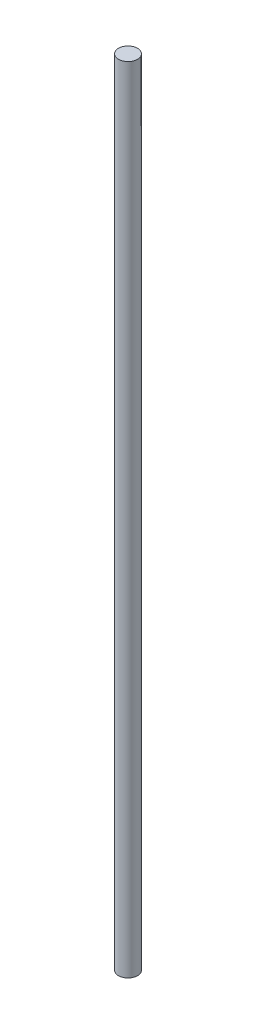
ISO-10303-21;
HEADER;
FILE_DESCRIPTION(('STEP AP214'),'2;1');
FILE_NAME('part.step','',(''),(''),'','','');
FILE_SCHEMA(('AUTOMOTIVE_DESIGN { 1 0 10303 214 1 1 1 1 }'));
ENDSEC;
DATA;
#1=APPLICATION_CONTEXT('core data for automotive mechanical design processes');
#2=APPLICATION_PROTOCOL_DEFINITION('international standard','automotive_design',2000,#1);
#3=PRODUCT_CONTEXT('',#1,'mechanical');
#4=PRODUCT('Part','Part','',(#3));
#5=PRODUCT_RELATED_PRODUCT_CATEGORY('part','',(#4));
#6=PRODUCT_DEFINITION_FORMATION('','',#4);
#7=PRODUCT_DEFINITION_CONTEXT('part definition',#1,'design');
#8=PRODUCT_DEFINITION('design','',#6,#7);
#9=PRODUCT_DEFINITION_SHAPE('','',#8);
#10=(LENGTH_UNIT() NAMED_UNIT(*) SI_UNIT(.MILLI.,.METRE.));
#11=(NAMED_UNIT(*) PLANE_ANGLE_UNIT() SI_UNIT($,.RADIAN.));
#12=(NAMED_UNIT(*) SI_UNIT($,.STERADIAN.) SOLID_ANGLE_UNIT());
#13=UNCERTAINTY_MEASURE_WITH_UNIT(LENGTH_MEASURE(1.E-05),#10,'distance_accuracy_value','');
#14=(GEOMETRIC_REPRESENTATION_CONTEXT(3) GLOBAL_UNCERTAINTY_ASSIGNED_CONTEXT((#13)) GLOBAL_UNIT_ASSIGNED_CONTEXT((#10,
#11,#12)) REPRESENTATION_CONTEXT('',''));
#15=CARTESIAN_POINT('',(0.,0.,0.));
#16=DIRECTION('',(0.,0.,1.));
#17=DIRECTION('',(1.,0.,0.));
#18=AXIS2_PLACEMENT_3D('',#15,#16,#17);
#19=CARTESIAN_POINT('',(0.,416.,0.));
#20=DIRECTION('',(0.,-1.,0.));
#21=DIRECTION('',(0.,0.,-1.));
#22=AXIS2_PLACEMENT_3D('',#19,#20,#21);
#23=CYLINDRICAL_SURFACE('',#22,5.);
#24=CARTESIAN_POINT('',(0.,416.,0.));
#25=DIRECTION('',(0.,1.,0.));
#26=DIRECTION('',(0.,0.,1.));
#27=AXIS2_PLACEMENT_3D('',#24,#25,#26);
#28=CIRCLE('',#27,5.);
#29=CARTESIAN_POINT('',(0.,416.,-5.));
#30=VERTEX_POINT('',#29);
#31=EDGE_CURVE('E10',#30,#30,#28,.T.);
#32=CARTESIAN_POINT('',(0.,0.,0.));
#33=DIRECTION('',(0.,1.,0.));
#34=DIRECTION('',(0.,0.,1.));
#35=AXIS2_PLACEMENT_3D('',#32,#33,#34);
#36=CIRCLE('',#35,5.);
#37=CARTESIAN_POINT('',(0.,0.,-5.));
#38=VERTEX_POINT('',#37);
#39=EDGE_CURVE('E44',#38,#38,#36,.T.);
#40=CARTESIAN_POINT('',(0.,416.,-5.));
#41=CARTESIAN_POINT('',(0.,411.666666666667,-5.));
#42=CARTESIAN_POINT('',(0.,407.333333333333,-5.));
#43=CARTESIAN_POINT('',(0.,398.666666666667,-5.));
#44=CARTESIAN_POINT('',(0.,394.333333333333,-5.));
#45=CARTESIAN_POINT('',(0.,385.666666666667,-5.));
#46=CARTESIAN_POINT('',(0.,381.333333333333,-5.));
#47=CARTESIAN_POINT('',(0.,372.666666666667,-5.));
#48=CARTESIAN_POINT('',(0.,368.333333333333,-5.));
#49=CARTESIAN_POINT('',(0.,359.666666666667,-5.));
#50=CARTESIAN_POINT('',(0.,355.333333333333,-5.));
#51=CARTESIAN_POINT('',(0.,346.666666666667,-5.));
#52=CARTESIAN_POINT('',(0.,342.333333333333,-5.));
#53=CARTESIAN_POINT('',(0.,333.666666666667,-5.));
#54=CARTESIAN_POINT('',(0.,329.333333333333,-5.));
#55=CARTESIAN_POINT('',(0.,320.666666666667,-5.));
#56=CARTESIAN_POINT('',(0.,316.333333333333,-5.));
#57=CARTESIAN_POINT('',(0.,307.666666666667,-5.));
#58=CARTESIAN_POINT('',(0.,303.333333333333,-5.));
#59=CARTESIAN_POINT('',(0.,294.666666666667,-5.));
#60=CARTESIAN_POINT('',(0.,290.333333333333,-5.));
#61=CARTESIAN_POINT('',(0.,281.666666666667,-5.));
#62=CARTESIAN_POINT('',(0.,277.333333333333,-5.));
#63=CARTESIAN_POINT('',(0.,268.666666666667,-5.));
#64=CARTESIAN_POINT('',(0.,264.333333333333,-5.));
#65=CARTESIAN_POINT('',(0.,255.666666666667,-5.));
#66=CARTESIAN_POINT('',(0.,251.333333333333,-5.));
#67=CARTESIAN_POINT('',(0.,242.666666666667,-5.));
#68=CARTESIAN_POINT('',(0.,238.333333333333,-5.));
#69=CARTESIAN_POINT('',(0.,229.666666666667,-5.));
#70=CARTESIAN_POINT('',(0.,225.333333333333,-5.));
#71=CARTESIAN_POINT('',(0.,216.666666666667,-5.));
#72=CARTESIAN_POINT('',(0.,212.333333333333,-5.));
#73=CARTESIAN_POINT('',(0.,203.666666666667,-5.));
#74=CARTESIAN_POINT('',(0.,199.333333333333,-5.));
#75=CARTESIAN_POINT('',(0.,190.666666666667,-5.));
#76=CARTESIAN_POINT('',(0.,186.333333333333,-5.));
#77=CARTESIAN_POINT('',(0.,177.666666666667,-5.));
#78=CARTESIAN_POINT('',(0.,173.333333333333,-5.));
#79=CARTESIAN_POINT('',(0.,164.666666666667,-5.));
#80=CARTESIAN_POINT('',(0.,160.333333333333,-5.));
#81=CARTESIAN_POINT('',(0.,151.666666666667,-5.));
#82=CARTESIAN_POINT('',(0.,147.333333333333,-5.));
#83=CARTESIAN_POINT('',(0.,138.666666666667,-5.));
#84=CARTESIAN_POINT('',(0.,134.333333333333,-5.));
#85=CARTESIAN_POINT('',(0.,125.666666666667,-5.));
#86=CARTESIAN_POINT('',(0.,121.333333333333,-5.));
#87=CARTESIAN_POINT('',(0.,112.666666666667,-5.));
#88=CARTESIAN_POINT('',(0.,108.333333333333,-5.));
#89=CARTESIAN_POINT('',(0.,99.6666666666667,-5.));
#90=CARTESIAN_POINT('',(0.,95.3333333333333,-5.));
#91=CARTESIAN_POINT('',(0.,86.6666666666667,-5.));
#92=CARTESIAN_POINT('',(0.,82.3333333333334,-5.));
#93=CARTESIAN_POINT('',(0.,73.6666666666667,-5.));
#94=CARTESIAN_POINT('',(0.,69.3333333333333,-5.));
#95=CARTESIAN_POINT('',(0.,60.6666666666667,-5.));
#96=CARTESIAN_POINT('',(0.,56.3333333333333,-5.));
#97=CARTESIAN_POINT('',(0.,47.6666666666667,-5.));
#98=CARTESIAN_POINT('',(0.,43.3333333333333,-5.));
#99=CARTESIAN_POINT('',(0.,34.6666666666667,-5.));
#100=CARTESIAN_POINT('',(0.,30.3333333333333,-5.));
#101=CARTESIAN_POINT('',(0.,21.6666666666667,-5.));
#102=CARTESIAN_POINT('',(0.,17.3333333333333,-5.));
#103=CARTESIAN_POINT('',(0.,8.66666666666668,-5.));
#104=CARTESIAN_POINT('',(0.,4.33333333333334,-5.));
#105=CARTESIAN_POINT('',(0.,0.,-5.));
#106=B_SPLINE_CURVE_WITH_KNOTS('',3,(#40,#41,#42,#43,#44,#45,#46,#47,#48,#49,#50,#51,#52,#53,
#54,#55,#56,#57,#58,#59,#60,#61,#62,#63,#64,#65,#66,#67,#68,#69,#70,#71,#72,#73,#74,#75,#76,#77,
#78,#79,#80,#81,#82,#83,#84,#85,#86,#87,#88,#89,#90,#91,#92,#93,#94,#95,#96,#97,#98,#99,#100,
#101,#102,#103,#104,#105),.UNSPECIFIED.,.F.,.F.,(4,2,2,2,2,2,2,2,2,2,2,2,2,2,2,2,2,2,2,2,2,2,2,
2,2,2,2,2,2,2,2,2,4),(0.,13.,26.,39.,52.,65.,78.,91.,104.,117.,130.,143.,156.,169.,182.,195.,
208.,221.,234.,247.,260.,273.,286.,299.,312.,325.,338.,351.,364.,377.,390.,403.,416.),.UNSPECIFIED.);
#107=EDGE_CURVE('BSEAM41',#30,#38,#106,.T.);
#108=ORIENTED_EDGE('',*,*,#31,.F.);
#109=ORIENTED_EDGE('',*,*,#39,.T.);
#110=ORIENTED_EDGE('',*,*,#107,.T.);
#111=ORIENTED_EDGE('',*,*,#107,.F.);
#112=EDGE_LOOP('',(#108,#110,#109,#111));
#113=FACE_BOUND('',#112,.T.);
#114=ADVANCED_FACE('F41',(#113),#23,.T.);
#115=CARTESIAN_POINT('',(0.,416.,0.));
#116=DIRECTION('',(0.,1.,0.));
#117=DIRECTION('',(0.,0.,1.));
#118=AXIS2_PLACEMENT_3D('',#115,#116,#117);
#119=PLANE('',#118);
#120=ORIENTED_EDGE('',*,*,#31,.T.);
#121=EDGE_LOOP('',(#120));
#122=FACE_BOUND('',#121,.T.);
#123=ADVANCED_FACE('F58',(#122),#119,.T.);
#124=CARTESIAN_POINT('',(0.,0.,0.));
#125=DIRECTION('',(0.,1.,0.));
#126=DIRECTION('',(0.,0.,1.));
#127=AXIS2_PLACEMENT_3D('',#124,#125,#126);
#128=PLANE('',#127);
#129=ORIENTED_EDGE('',*,*,#39,.F.);
#130=EDGE_LOOP('',(#129));
#131=FACE_BOUND('',#130,.T.);
#132=ADVANCED_FACE('F56',(#131),#128,.F.);
#133=CLOSED_SHELL('',(#114,#123,#132));
#134=MANIFOLD_SOLID_BREP('B2',#133);
#135=ADVANCED_BREP_SHAPE_REPRESENTATION('',(#18,#134),#14);
#136=SHAPE_DEFINITION_REPRESENTATION(#9,#135);
ENDSEC;
END-ISO-10303-21;
